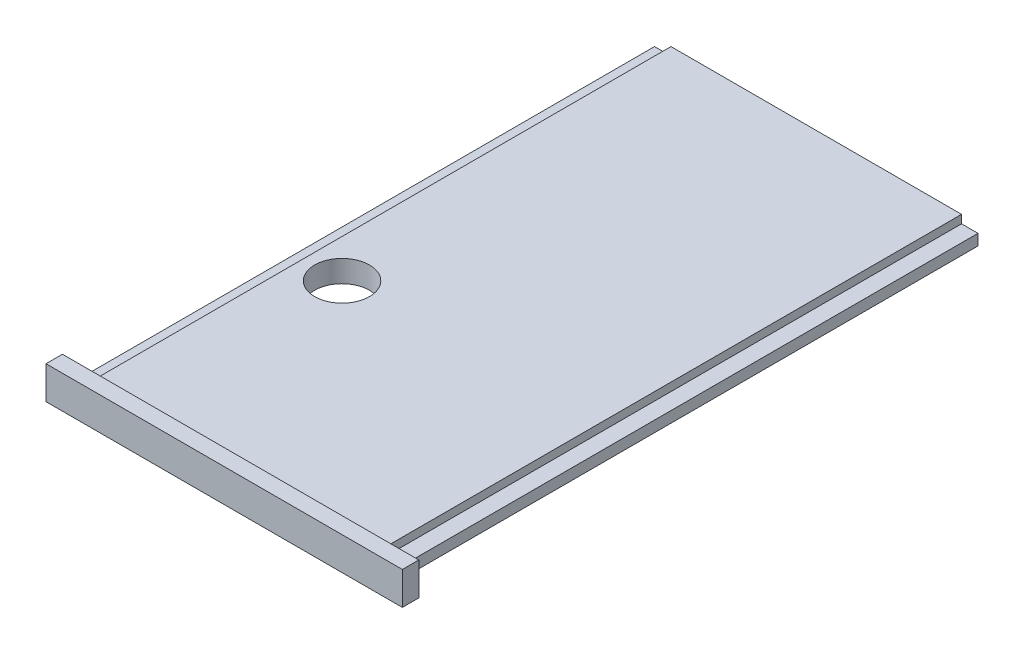
ISO-10303-21;
HEADER;
FILE_DESCRIPTION(('STEP AP214'),'2;1');
FILE_NAME('part.step','',(''),(''),'','','');
FILE_SCHEMA(('AUTOMOTIVE_DESIGN { 1 0 10303 214 1 1 1 1 }'));
ENDSEC;
DATA;
#1=APPLICATION_CONTEXT('core data for automotive mechanical design processes');
#2=APPLICATION_PROTOCOL_DEFINITION('international standard','automotive_design',2000,#1);
#3=PRODUCT_CONTEXT('',#1,'mechanical');
#4=PRODUCT('Part','Part','',(#3));
#5=PRODUCT_RELATED_PRODUCT_CATEGORY('part','',(#4));
#6=PRODUCT_DEFINITION_FORMATION('','',#4);
#7=PRODUCT_DEFINITION_CONTEXT('part definition',#1,'design');
#8=PRODUCT_DEFINITION('design','',#6,#7);
#9=PRODUCT_DEFINITION_SHAPE('','',#8);
#10=(LENGTH_UNIT() NAMED_UNIT(*) SI_UNIT(.MILLI.,.METRE.));
#11=(NAMED_UNIT(*) PLANE_ANGLE_UNIT() SI_UNIT($,.RADIAN.));
#12=(NAMED_UNIT(*) SI_UNIT($,.STERADIAN.) SOLID_ANGLE_UNIT());
#13=UNCERTAINTY_MEASURE_WITH_UNIT(LENGTH_MEASURE(1.E-05),#10,'distance_accuracy_value','');
#14=(GEOMETRIC_REPRESENTATION_CONTEXT(3) GLOBAL_UNCERTAINTY_ASSIGNED_CONTEXT((#13)) GLOBAL_UNIT_ASSIGNED_CONTEXT((#10,
#11,#12)) REPRESENTATION_CONTEXT('',''));
#15=CARTESIAN_POINT('',(0.,0.,0.));
#16=DIRECTION('',(0.,0.,1.));
#17=DIRECTION('',(1.,0.,0.));
#18=AXIS2_PLACEMENT_3D('',#15,#16,#17);
#19=CARTESIAN_POINT('',(0.,0.,0.));
#20=DIRECTION('',(0.,0.,-1.));
#21=DIRECTION('',(-1.,0.,0.));
#22=AXIS2_PLACEMENT_3D('',#19,#20,#21);
#23=PLANE('',#22);
#24=DIRECTION('',(0.,-1.,0.));
#25=VECTOR('',#24,1.);
#26=CARTESIAN_POINT('',(0.,0.,0.));
#27=LINE('',#26,#25);
#28=CARTESIAN_POINT('',(0.,6.,0.));
#29=VERTEX_POINT('',#28);
#30=CARTESIAN_POINT('',(0.,0.,0.));
#31=VERTEX_POINT('',#30);
#32=EDGE_CURVE('E296',#29,#31,#27,.T.);
#33=ORIENTED_EDGE('',*,*,#32,.F.);
#34=DIRECTION('',(-1.,0.,0.));
#35=VECTOR('',#34,1.);
#36=CARTESIAN_POINT('',(0.,6.,0.));
#37=LINE('',#36,#35);
#38=CARTESIAN_POINT('',(65.,6.,0.));
#39=VERTEX_POINT('',#38);
#40=EDGE_CURVE('E347',#39,#29,#37,.T.);
#41=ORIENTED_EDGE('',*,*,#40,.F.);
#42=DIRECTION('',(0.,1.,0.));
#43=VECTOR('',#42,1.);
#44=CARTESIAN_POINT('',(65.,0.,0.));
#45=LINE('',#44,#43);
#46=CARTESIAN_POINT('',(65.,0.,0.));
#47=VERTEX_POINT('',#46);
#48=EDGE_CURVE('E363',#47,#39,#45,.T.);
#49=ORIENTED_EDGE('',*,*,#48,.F.);
#50=DIRECTION('',(1.,0.,0.));
#51=VECTOR('',#50,1.);
#52=CARTESIAN_POINT('',(0.,0.,0.));
#53=LINE('',#52,#51);
#54=EDGE_CURVE('E360',#31,#47,#53,.T.);
#55=ORIENTED_EDGE('',*,*,#54,.F.);
#56=EDGE_LOOP('',(#33,#41,#49,#55));
#57=FACE_BOUND('',#56,.T.);
#58=DIRECTION('',(-1.,0.,0.));
#59=VECTOR('',#58,1.);
#60=CARTESIAN_POINT('',(59.,1.1,0.));
#61=LINE('',#60,#59);
#62=CARTESIAN_POINT('',(59.,1.1,0.));
#63=VERTEX_POINT('',#62);
#64=CARTESIAN_POINT('',(6.00000000000001,1.1,0.));
#65=VERTEX_POINT('',#64);
#66=EDGE_CURVE('E217',#63,#65,#61,.T.);
#67=ORIENTED_EDGE('',*,*,#66,.F.);
#68=DIRECTION('',(0.,1.,0.));
#69=VECTOR('',#68,1.);
#70=CARTESIAN_POINT('',(59.,1.1,0.));
#71=LINE('',#70,#69);
#72=CARTESIAN_POINT('',(59.,1.6,0.));
#73=VERTEX_POINT('',#72);
#74=EDGE_CURVE('E107',#63,#73,#71,.T.);
#75=ORIENTED_EDGE('',*,*,#74,.T.);
#76=DIRECTION('',(1.,0.,0.));
#77=VECTOR('',#76,1.);
#78=CARTESIAN_POINT('',(59.,1.6,0.));
#79=LINE('',#78,#77);
#80=CARTESIAN_POINT('',(62.,1.6,0.));
#81=VERTEX_POINT('',#80);
#82=EDGE_CURVE('E112',#73,#81,#79,.T.);
#83=ORIENTED_EDGE('',*,*,#82,.T.);
#84=DIRECTION('',(0.,-1.,0.));
#85=VECTOR('',#84,1.);
#86=CARTESIAN_POINT('',(62.,3.6,0.));
#87=LINE('',#86,#85);
#88=CARTESIAN_POINT('',(62.,3.6,0.));
#89=VERTEX_POINT('',#88);
#90=EDGE_CURVE('E286',#89,#81,#87,.T.);
#91=ORIENTED_EDGE('',*,*,#90,.F.);
#92=DIRECTION('',(1.,0.,0.));
#93=VECTOR('',#92,1.);
#94=CARTESIAN_POINT('',(59.,3.6,0.));
#95=LINE('',#94,#93);
#96=CARTESIAN_POINT('',(59.,3.6,0.));
#97=VERTEX_POINT('',#96);
#98=EDGE_CURVE('E277',#97,#89,#95,.T.);
#99=ORIENTED_EDGE('',*,*,#98,.F.);
#100=CARTESIAN_POINT('',(59.,5.1,0.));
#101=VERTEX_POINT('',#100);
#102=EDGE_CURVE('E250',#97,#101,#71,.T.);
#103=ORIENTED_EDGE('',*,*,#102,.T.);
#104=DIRECTION('',(-1.,0.,0.));
#105=VECTOR('',#104,1.);
#106=CARTESIAN_POINT('',(59.,5.1,0.));
#107=LINE('',#106,#105);
#108=CARTESIAN_POINT('',(6.00000000000001,5.1,0.));
#109=VERTEX_POINT('',#108);
#110=EDGE_CURVE('E224',#101,#109,#107,.T.);
#111=ORIENTED_EDGE('',*,*,#110,.T.);
#112=DIRECTION('',(0.,1.,0.));
#113=VECTOR('',#112,1.);
#114=CARTESIAN_POINT('',(6.00000000000001,1.1,0.));
#115=LINE('',#114,#113);
#116=CARTESIAN_POINT('',(6.00000000000001,3.6,0.));
#117=VERTEX_POINT('',#116);
#118=EDGE_CURVE('E253',#117,#109,#115,.T.);
#119=ORIENTED_EDGE('',*,*,#118,.F.);
#120=DIRECTION('',(-1.,0.,0.));
#121=VECTOR('',#120,1.);
#122=CARTESIAN_POINT('',(6.00000000000001,3.6,0.));
#123=LINE('',#122,#121);
#124=CARTESIAN_POINT('',(3.,3.6,0.));
#125=VERTEX_POINT('',#124);
#126=EDGE_CURVE('E311',#117,#125,#123,.T.);
#127=ORIENTED_EDGE('',*,*,#126,.T.);
#128=DIRECTION('',(0.,-1.,0.));
#129=VECTOR('',#128,1.);
#130=CARTESIAN_POINT('',(3.,3.6,0.));
#131=LINE('',#130,#129);
#132=CARTESIAN_POINT('',(3.,1.6,0.));
#133=VERTEX_POINT('',#132);
#134=EDGE_CURVE('E324',#125,#133,#131,.T.);
#135=ORIENTED_EDGE('',*,*,#134,.T.);
#136=DIRECTION('',(-1.,0.,0.));
#137=VECTOR('',#136,1.);
#138=CARTESIAN_POINT('',(6.00000000000001,1.6,0.));
#139=LINE('',#138,#137);
#140=CARTESIAN_POINT('',(6.00000000000001,1.6,0.));
#141=VERTEX_POINT('',#140);
#142=EDGE_CURVE('E320',#141,#133,#139,.T.);
#143=ORIENTED_EDGE('',*,*,#142,.F.);
#144=EDGE_CURVE('E254',#65,#141,#115,.T.);
#145=ORIENTED_EDGE('',*,*,#144,.F.);
#146=EDGE_LOOP('',(#67,#75,#83,#91,#99,#103,#111,#119,#127,#135,#143,#145));
#147=FACE_BOUND('',#146,.T.);
#148=ADVANCED_FACE('F91',(#57,#147),#23,.T.);
#149=CARTESIAN_POINT('',(0.,0.,3.));
#150=DIRECTION('',(1.,0.,0.));
#151=DIRECTION('',(0.,0.,-1.));
#152=AXIS2_PLACEMENT_3D('',#149,#150,#151);
#153=PLANE('',#152);
#154=ORIENTED_EDGE('',*,*,#32,.T.);
#155=DIRECTION('',(0.,0.,-1.));
#156=VECTOR('',#155,1.);
#157=CARTESIAN_POINT('',(0.,0.,3.));
#158=LINE('',#157,#156);
#159=CARTESIAN_POINT('',(0.,0.,3.));
#160=VERTEX_POINT('',#159);
#161=EDGE_CURVE('E12',#160,#31,#158,.T.);
#162=ORIENTED_EDGE('',*,*,#161,.F.);
#163=DIRECTION('',(0.,-1.,0.));
#164=VECTOR('',#163,1.);
#165=CARTESIAN_POINT('',(0.,0.,3.));
#166=LINE('',#165,#164);
#167=CARTESIAN_POINT('',(0.,6.,3.));
#168=VERTEX_POINT('',#167);
#169=EDGE_CURVE('E342',#168,#160,#166,.T.);
#170=ORIENTED_EDGE('',*,*,#169,.F.);
#171=DIRECTION('',(0.,0.,-1.));
#172=VECTOR('',#171,1.);
#173=CARTESIAN_POINT('',(0.,6.,3.));
#174=LINE('',#173,#172);
#175=EDGE_CURVE('E356',#168,#29,#174,.T.);
#176=ORIENTED_EDGE('',*,*,#175,.T.);
#177=EDGE_LOOP('',(#154,#162,#170,#176));
#178=FACE_BOUND('',#177,.T.);
#179=ADVANCED_FACE('F93',(#178),#153,.F.);
#180=CARTESIAN_POINT('',(0.,0.,3.));
#181=DIRECTION('',(0.,1.,0.));
#182=DIRECTION('',(0.,0.,1.));
#183=AXIS2_PLACEMENT_3D('',#180,#181,#182);
#184=PLANE('',#183);
#185=ORIENTED_EDGE('',*,*,#54,.T.);
#186=DIRECTION('',(0.,0.,-1.));
#187=VECTOR('',#186,1.);
#188=CARTESIAN_POINT('',(65.,0.,3.));
#189=LINE('',#188,#187);
#190=CARTESIAN_POINT('',(65.,0.,3.));
#191=VERTEX_POINT('',#190);
#192=EDGE_CURVE('E100',#191,#47,#189,.T.);
#193=ORIENTED_EDGE('',*,*,#192,.F.);
#194=DIRECTION('',(1.,0.,0.));
#195=VECTOR('',#194,1.);
#196=CARTESIAN_POINT('',(0.,0.,3.));
#197=LINE('',#196,#195);
#198=EDGE_CURVE('E346',#160,#191,#197,.T.);
#199=ORIENTED_EDGE('',*,*,#198,.F.);
#200=ORIENTED_EDGE('',*,*,#161,.T.);
#201=EDGE_LOOP('',(#185,#193,#199,#200));
#202=FACE_BOUND('',#201,.T.);
#203=ADVANCED_FACE('F395',(#202),#184,.F.);
#204=CARTESIAN_POINT('',(65.,0.,3.));
#205=DIRECTION('',(-1.,0.,0.));
#206=DIRECTION('',(0.,0.,1.));
#207=AXIS2_PLACEMENT_3D('',#204,#205,#206);
#208=PLANE('',#207);
#209=ORIENTED_EDGE('',*,*,#48,.T.);
#210=DIRECTION('',(0.,0.,-1.));
#211=VECTOR('',#210,1.);
#212=CARTESIAN_POINT('',(65.,6.,3.));
#213=LINE('',#212,#211);
#214=CARTESIAN_POINT('',(65.,6.,3.));
#215=VERTEX_POINT('',#214);
#216=EDGE_CURVE('E371',#215,#39,#213,.T.);
#217=ORIENTED_EDGE('',*,*,#216,.F.);
#218=DIRECTION('',(0.,1.,0.));
#219=VECTOR('',#218,1.);
#220=CARTESIAN_POINT('',(65.,0.,3.));
#221=LINE('',#220,#219);
#222=EDGE_CURVE('E350',#191,#215,#221,.T.);
#223=ORIENTED_EDGE('',*,*,#222,.F.);
#224=ORIENTED_EDGE('',*,*,#192,.T.);
#225=EDGE_LOOP('',(#209,#217,#223,#224));
#226=FACE_BOUND('',#225,.T.);
#227=ADVANCED_FACE('F380',(#226),#208,.F.);
#228=CARTESIAN_POINT('',(0.,6.,3.));
#229=DIRECTION('',(0.,-1.,0.));
#230=DIRECTION('',(0.,0.,-1.));
#231=AXIS2_PLACEMENT_3D('',#228,#229,#230);
#232=PLANE('',#231);
#233=ORIENTED_EDGE('',*,*,#40,.T.);
#234=ORIENTED_EDGE('',*,*,#175,.F.);
#235=DIRECTION('',(-1.,0.,0.));
#236=VECTOR('',#235,1.);
#237=CARTESIAN_POINT('',(0.,6.,3.));
#238=LINE('',#237,#236);
#239=EDGE_CURVE('E353',#215,#168,#238,.T.);
#240=ORIENTED_EDGE('',*,*,#239,.F.);
#241=ORIENTED_EDGE('',*,*,#216,.T.);
#242=EDGE_LOOP('',(#233,#234,#240,#241));
#243=FACE_BOUND('',#242,.T.);
#244=ADVANCED_FACE('F388',(#243),#232,.F.);
#245=CARTESIAN_POINT('',(0.,0.,3.));
#246=DIRECTION('',(0.,0.,-1.));
#247=DIRECTION('',(-1.,0.,0.));
#248=AXIS2_PLACEMENT_3D('',#245,#246,#247);
#249=PLANE('',#248);
#250=ORIENTED_EDGE('',*,*,#169,.T.);
#251=ORIENTED_EDGE('',*,*,#198,.T.);
#252=ORIENTED_EDGE('',*,*,#222,.T.);
#253=ORIENTED_EDGE('',*,*,#239,.T.);
#254=EDGE_LOOP('',(#250,#251,#252,#253));
#255=FACE_BOUND('',#254,.T.);
#256=ADVANCED_FACE('F394',(#255),#249,.F.);
#257=CARTESIAN_POINT('',(59.,1.1,-105.));
#258=DIRECTION('',(0.,1.,0.));
#259=DIRECTION('',(0.,0.,1.));
#260=AXIS2_PLACEMENT_3D('',#257,#258,#259);
#261=PLANE('',#260);
#262=CARTESIAN_POINT('',(13.,1.1,-38.));
#263=DIRECTION('',(0.,1.,0.));
#264=DIRECTION('',(0.,0.,1.));
#265=AXIS2_PLACEMENT_3D('',#262,#263,#264);
#266=CIRCLE('',#265,5.);
#267=CARTESIAN_POINT('',(13.,1.1,-33.));
#268=VERTEX_POINT('',#267);
#269=EDGE_CURVE('E325',#268,#268,#266,.T.);
#270=ORIENTED_EDGE('',*,*,#269,.T.);
#271=EDGE_LOOP('',(#270));
#272=FACE_BOUND('',#271,.T.);
#273=ORIENTED_EDGE('',*,*,#66,.T.);
#274=DIRECTION('',(0.,0.,1.));
#275=VECTOR('',#274,1.);
#276=CARTESIAN_POINT('',(6.00000000000001,1.1,-105.));
#277=LINE('',#276,#275);
#278=CARTESIAN_POINT('',(6.00000000000001,1.1,-105.));
#279=VERTEX_POINT('',#278);
#280=EDGE_CURVE('E266',#279,#65,#277,.T.);
#281=ORIENTED_EDGE('',*,*,#280,.F.);
#282=DIRECTION('',(-1.,0.,0.));
#283=VECTOR('',#282,1.);
#284=CARTESIAN_POINT('',(59.,1.1,-105.));
#285=LINE('',#284,#283);
#286=CARTESIAN_POINT('',(59.,1.1,-105.));
#287=VERTEX_POINT('',#286);
#288=EDGE_CURVE('E227',#287,#279,#285,.T.);
#289=ORIENTED_EDGE('',*,*,#288,.F.);
#290=DIRECTION('',(0.,0.,1.));
#291=VECTOR('',#290,1.);
#292=CARTESIAN_POINT('',(59.,1.1,-105.));
#293=LINE('',#292,#291);
#294=EDGE_CURVE('E261',#287,#63,#293,.T.);
#295=ORIENTED_EDGE('',*,*,#294,.T.);
#296=EDGE_LOOP('',(#273,#281,#289,#295));
#297=FACE_BOUND('',#296,.T.);
#298=ADVANCED_FACE('F413',(#272,#297),#261,.F.);
#299=CARTESIAN_POINT('',(59.,5.1,-105.));
#300=DIRECTION('',(0.,1.,0.));
#301=DIRECTION('',(0.,0.,1.));
#302=AXIS2_PLACEMENT_3D('',#299,#300,#301);
#303=PLANE('',#302);
#304=CARTESIAN_POINT('',(13.,5.1,-38.));
#305=DIRECTION('',(0.,1.,0.));
#306=DIRECTION('',(0.,0.,1.));
#307=AXIS2_PLACEMENT_3D('',#304,#305,#306);
#308=CIRCLE('',#307,5.);
#309=CARTESIAN_POINT('',(13.,5.1,-33.));
#310=VERTEX_POINT('',#309);
#311=EDGE_CURVE('E472',#310,#310,#308,.T.);
#312=ORIENTED_EDGE('',*,*,#311,.F.);
#313=EDGE_LOOP('',(#312));
#314=FACE_BOUND('',#313,.T.);
#315=ORIENTED_EDGE('',*,*,#110,.F.);
#316=DIRECTION('',(0.,0.,1.));
#317=VECTOR('',#316,1.);
#318=CARTESIAN_POINT('',(59.,5.1,-105.));
#319=LINE('',#318,#317);
#320=CARTESIAN_POINT('',(59.,5.1,-105.));
#321=VERTEX_POINT('',#320);
#322=EDGE_CURVE('E208',#321,#101,#319,.T.);
#323=ORIENTED_EDGE('',*,*,#322,.F.);
#324=DIRECTION('',(-1.,0.,0.));
#325=VECTOR('',#324,1.);
#326=CARTESIAN_POINT('',(59.,5.1,-105.));
#327=LINE('',#326,#325);
#328=CARTESIAN_POINT('',(6.00000000000001,5.1,-105.));
#329=VERTEX_POINT('',#328);
#330=EDGE_CURVE('E223',#321,#329,#327,.T.);
#331=ORIENTED_EDGE('',*,*,#330,.T.);
#332=DIRECTION('',(0.,0.,1.));
#333=VECTOR('',#332,1.);
#334=CARTESIAN_POINT('',(6.00000000000001,5.1,-105.));
#335=LINE('',#334,#333);
#336=EDGE_CURVE('E226',#329,#109,#335,.T.);
#337=ORIENTED_EDGE('',*,*,#336,.T.);
#338=EDGE_LOOP('',(#315,#323,#331,#337));
#339=FACE_BOUND('',#338,.T.);
#340=ADVANCED_FACE('F221',(#314,#339),#303,.T.);
#341=CARTESIAN_POINT('',(0.,0.,-105.));
#342=DIRECTION('',(0.,0.,1.));
#343=DIRECTION('',(1.,0.,0.));
#344=AXIS2_PLACEMENT_3D('',#341,#342,#343);
#345=PLANE('',#344);
#346=DIRECTION('',(0.,1.,0.));
#347=VECTOR('',#346,1.);
#348=CARTESIAN_POINT('',(59.,1.1,-105.));
#349=LINE('',#348,#347);
#350=CARTESIAN_POINT('',(59.,1.6,-105.));
#351=VERTEX_POINT('',#350);
#352=EDGE_CURVE('E216',#287,#351,#349,.T.);
#353=ORIENTED_EDGE('',*,*,#352,.F.);
#354=ORIENTED_EDGE('',*,*,#288,.T.);
#355=DIRECTION('',(0.,1.,0.));
#356=VECTOR('',#355,1.);
#357=CARTESIAN_POINT('',(6.00000000000001,1.1,-105.));
#358=LINE('',#357,#356);
#359=CARTESIAN_POINT('',(6.00000000000001,1.6,-105.));
#360=VERTEX_POINT('',#359);
#361=EDGE_CURVE('E239',#279,#360,#358,.T.);
#362=ORIENTED_EDGE('',*,*,#361,.T.);
#363=DIRECTION('',(-1.,0.,0.));
#364=VECTOR('',#363,1.);
#365=CARTESIAN_POINT('',(6.00000000000001,1.6,-105.));
#366=LINE('',#365,#364);
#367=CARTESIAN_POINT('',(3.,1.6,-105.));
#368=VERTEX_POINT('',#367);
#369=EDGE_CURVE('E307',#360,#368,#366,.T.);
#370=ORIENTED_EDGE('',*,*,#369,.T.);
#371=DIRECTION('',(0.,-1.,0.));
#372=VECTOR('',#371,1.);
#373=CARTESIAN_POINT('',(3.,3.6,-105.));
#374=LINE('',#373,#372);
#375=CARTESIAN_POINT('',(3.,3.6,-105.));
#376=VERTEX_POINT('',#375);
#377=EDGE_CURVE('E310',#376,#368,#374,.T.);
#378=ORIENTED_EDGE('',*,*,#377,.F.);
#379=DIRECTION('',(-1.,0.,0.));
#380=VECTOR('',#379,1.);
#381=CARTESIAN_POINT('',(6.00000000000001,3.6,-105.));
#382=LINE('',#381,#380);
#383=CARTESIAN_POINT('',(6.00000000000001,3.6,-105.));
#384=VERTEX_POINT('',#383);
#385=EDGE_CURVE('E315',#384,#376,#382,.T.);
#386=ORIENTED_EDGE('',*,*,#385,.F.);
#387=EDGE_CURVE('E233',#384,#329,#358,.T.);
#388=ORIENTED_EDGE('',*,*,#387,.T.);
#389=ORIENTED_EDGE('',*,*,#330,.F.);
#390=CARTESIAN_POINT('',(59.,3.6,-105.));
#391=VERTEX_POINT('',#390);
#392=EDGE_CURVE('E204',#391,#321,#349,.T.);
#393=ORIENTED_EDGE('',*,*,#392,.F.);
#394=DIRECTION('',(1.,0.,0.));
#395=VECTOR('',#394,1.);
#396=CARTESIAN_POINT('',(59.,3.6,-105.));
#397=LINE('',#396,#395);
#398=CARTESIAN_POINT('',(62.,3.6,-105.));
#399=VERTEX_POINT('',#398);
#400=EDGE_CURVE('E280',#391,#399,#397,.T.);
#401=ORIENTED_EDGE('',*,*,#400,.T.);
#402=DIRECTION('',(0.,-1.,0.));
#403=VECTOR('',#402,1.);
#404=CARTESIAN_POINT('',(62.,3.6,-105.));
#405=LINE('',#404,#403);
#406=CARTESIAN_POINT('',(62.,1.6,-105.));
#407=VERTEX_POINT('',#406);
#408=EDGE_CURVE('E276',#399,#407,#405,.T.);
#409=ORIENTED_EDGE('',*,*,#408,.T.);
#410=DIRECTION('',(1.,0.,0.));
#411=VECTOR('',#410,1.);
#412=CARTESIAN_POINT('',(59.,1.6,-105.));
#413=LINE('',#412,#411);
#414=EDGE_CURVE('E272',#351,#407,#413,.T.);
#415=ORIENTED_EDGE('',*,*,#414,.F.);
#416=EDGE_LOOP('',(#353,#354,#362,#370,#378,#386,#388,#389,#393,#401,#409,#415));
#417=FACE_BOUND('',#416,.T.);
#418=ADVANCED_FACE('F230',(#417),#345,.F.);
#419=CARTESIAN_POINT('',(6.00000000000001,1.1,-105.));
#420=DIRECTION('',(1.,0.,0.));
#421=DIRECTION('',(0.,0.,-1.));
#422=AXIS2_PLACEMENT_3D('',#419,#420,#421);
#423=PLANE('',#422);
#424=ORIENTED_EDGE('',*,*,#387,.F.);
#425=DIRECTION('',(0.,0.,1.));
#426=VECTOR('',#425,1.);
#427=CARTESIAN_POINT('',(6.00000000000001,3.6,-105.));
#428=LINE('',#427,#426);
#429=EDGE_CURVE('E265',#384,#117,#428,.T.);
#430=ORIENTED_EDGE('',*,*,#429,.T.);
#431=ORIENTED_EDGE('',*,*,#118,.T.);
#432=ORIENTED_EDGE('',*,*,#336,.F.);
#433=EDGE_LOOP('',(#424,#430,#431,#432));
#434=FACE_BOUND('',#433,.T.);
#435=ADVANCED_FACE('F429',(#434),#423,.F.);
#436=DIRECTION('',(0.,0.,1.));
#437=VECTOR('',#436,1.);
#438=CARTESIAN_POINT('',(6.00000000000001,1.6,-105.));
#439=LINE('',#438,#437);
#440=EDGE_CURVE('E306',#360,#141,#439,.T.);
#441=ORIENTED_EDGE('',*,*,#440,.F.);
#442=ORIENTED_EDGE('',*,*,#361,.F.);
#443=ORIENTED_EDGE('',*,*,#280,.T.);
#444=ORIENTED_EDGE('',*,*,#144,.T.);
#445=EDGE_LOOP('',(#441,#442,#443,#444));
#446=FACE_BOUND('',#445,.T.);
#447=ADVANCED_FACE('F431',(#446),#423,.F.);
#448=CARTESIAN_POINT('',(59.,1.1,-105.));
#449=DIRECTION('',(1.,0.,0.));
#450=DIRECTION('',(0.,0.,-1.));
#451=AXIS2_PLACEMENT_3D('',#448,#449,#450);
#452=PLANE('',#451);
#453=ORIENTED_EDGE('',*,*,#352,.T.);
#454=DIRECTION('',(0.,0.,1.));
#455=VECTOR('',#454,1.);
#456=CARTESIAN_POINT('',(59.,1.6,-105.));
#457=LINE('',#456,#455);
#458=EDGE_CURVE('E297',#351,#73,#457,.T.);
#459=ORIENTED_EDGE('',*,*,#458,.T.);
#460=ORIENTED_EDGE('',*,*,#74,.F.);
#461=ORIENTED_EDGE('',*,*,#294,.F.);
#462=EDGE_LOOP('',(#453,#459,#460,#461));
#463=FACE_BOUND('',#462,.T.);
#464=ADVANCED_FACE('F437',(#463),#452,.T.);
#465=DIRECTION('',(0.,0.,1.));
#466=VECTOR('',#465,1.);
#467=CARTESIAN_POINT('',(59.,3.6,-105.));
#468=LINE('',#467,#466);
#469=EDGE_CURVE('E211',#391,#97,#468,.T.);
#470=ORIENTED_EDGE('',*,*,#469,.F.);
#471=ORIENTED_EDGE('',*,*,#392,.T.);
#472=ORIENTED_EDGE('',*,*,#322,.T.);
#473=ORIENTED_EDGE('',*,*,#102,.F.);
#474=EDGE_LOOP('',(#470,#471,#472,#473));
#475=FACE_BOUND('',#474,.T.);
#476=ADVANCED_FACE('F206',(#475),#452,.T.);
#477=CARTESIAN_POINT('',(3.,3.6,-105.));
#478=DIRECTION('',(-1.,0.,0.));
#479=DIRECTION('',(0.,0.,1.));
#480=AXIS2_PLACEMENT_3D('',#477,#478,#479);
#481=PLANE('',#480);
#482=ORIENTED_EDGE('',*,*,#134,.F.);
#483=DIRECTION('',(0.,0.,1.));
#484=VECTOR('',#483,1.);
#485=CARTESIAN_POINT('',(3.,3.6,-105.));
#486=LINE('',#485,#484);
#487=EDGE_CURVE('E319',#376,#125,#486,.T.);
#488=ORIENTED_EDGE('',*,*,#487,.F.);
#489=ORIENTED_EDGE('',*,*,#377,.T.);
#490=DIRECTION('',(0.,0.,1.));
#491=VECTOR('',#490,1.);
#492=CARTESIAN_POINT('',(3.,1.6,-105.));
#493=LINE('',#492,#491);
#494=EDGE_CURVE('E287',#368,#133,#493,.T.);
#495=ORIENTED_EDGE('',*,*,#494,.T.);
#496=EDGE_LOOP('',(#482,#488,#489,#495));
#497=FACE_BOUND('',#496,.T.);
#498=ADVANCED_FACE('F436',(#497),#481,.T.);
#499=CARTESIAN_POINT('',(6.00000000000001,3.6,-105.));
#500=DIRECTION('',(0.,1.,0.));
#501=DIRECTION('',(0.,0.,1.));
#502=AXIS2_PLACEMENT_3D('',#499,#500,#501);
#503=PLANE('',#502);
#504=ORIENTED_EDGE('',*,*,#126,.F.);
#505=ORIENTED_EDGE('',*,*,#429,.F.);
#506=ORIENTED_EDGE('',*,*,#385,.T.);
#507=ORIENTED_EDGE('',*,*,#487,.T.);
#508=EDGE_LOOP('',(#504,#505,#506,#507));
#509=FACE_BOUND('',#508,.T.);
#510=ADVANCED_FACE('F446',(#509),#503,.T.);
#511=CARTESIAN_POINT('',(6.00000000000001,1.6,-105.));
#512=DIRECTION('',(0.,1.,0.));
#513=DIRECTION('',(-1.,0.,0.));
#514=AXIS2_PLACEMENT_3D('',#511,#512,#513);
#515=PLANE('',#514);
#516=ORIENTED_EDGE('',*,*,#142,.T.);
#517=ORIENTED_EDGE('',*,*,#494,.F.);
#518=ORIENTED_EDGE('',*,*,#369,.F.);
#519=ORIENTED_EDGE('',*,*,#440,.T.);
#520=EDGE_LOOP('',(#516,#517,#518,#519));
#521=FACE_BOUND('',#520,.T.);
#522=ADVANCED_FACE('F438',(#521),#515,.F.);
#523=CARTESIAN_POINT('',(62.,3.6,-105.));
#524=DIRECTION('',(-1.,0.,0.));
#525=DIRECTION('',(0.,0.,1.));
#526=AXIS2_PLACEMENT_3D('',#523,#524,#525);
#527=PLANE('',#526);
#528=ORIENTED_EDGE('',*,*,#90,.T.);
#529=DIRECTION('',(0.,0.,1.));
#530=VECTOR('',#529,1.);
#531=CARTESIAN_POINT('',(62.,1.6,-105.));
#532=LINE('',#531,#530);
#533=EDGE_CURVE('E283',#407,#81,#532,.T.);
#534=ORIENTED_EDGE('',*,*,#533,.F.);
#535=ORIENTED_EDGE('',*,*,#408,.F.);
#536=DIRECTION('',(0.,0.,1.));
#537=VECTOR('',#536,1.);
#538=CARTESIAN_POINT('',(62.,3.6,-105.));
#539=LINE('',#538,#537);
#540=EDGE_CURVE('E298',#399,#89,#539,.T.);
#541=ORIENTED_EDGE('',*,*,#540,.T.);
#542=EDGE_LOOP('',(#528,#534,#535,#541));
#543=FACE_BOUND('',#542,.T.);
#544=ADVANCED_FACE('F445',(#543),#527,.F.);
#545=CARTESIAN_POINT('',(59.,1.6,-105.));
#546=DIRECTION('',(0.,-1.,0.));
#547=DIRECTION('',(1.,0.,0.));
#548=AXIS2_PLACEMENT_3D('',#545,#546,#547);
#549=PLANE('',#548);
#550=ORIENTED_EDGE('',*,*,#82,.F.);
#551=ORIENTED_EDGE('',*,*,#458,.F.);
#552=ORIENTED_EDGE('',*,*,#414,.T.);
#553=ORIENTED_EDGE('',*,*,#533,.T.);
#554=EDGE_LOOP('',(#550,#551,#552,#553));
#555=FACE_BOUND('',#554,.T.);
#556=ADVANCED_FACE('F443',(#555),#549,.T.);
#557=CARTESIAN_POINT('',(59.,3.6,-105.));
#558=DIRECTION('',(0.,-1.,0.));
#559=DIRECTION('',(0.,0.,-1.));
#560=AXIS2_PLACEMENT_3D('',#557,#558,#559);
#561=PLANE('',#560);
#562=ORIENTED_EDGE('',*,*,#98,.T.);
#563=ORIENTED_EDGE('',*,*,#540,.F.);
#564=ORIENTED_EDGE('',*,*,#400,.F.);
#565=ORIENTED_EDGE('',*,*,#469,.T.);
#566=EDGE_LOOP('',(#562,#563,#564,#565));
#567=FACE_BOUND('',#566,.T.);
#568=ADVANCED_FACE('F439',(#567),#561,.F.);
#569=CARTESIAN_POINT('',(13.,-92.9,-38.));
#570=DIRECTION('',(0.,1.,0.));
#571=DIRECTION('',(0.,0.,1.));
#572=AXIS2_PLACEMENT_3D('',#569,#570,#571);
#573=CYLINDRICAL_SURFACE('',#572,5.);
#574=ORIENTED_EDGE('',*,*,#311,.T.);
#575=EDGE_LOOP('',(#574));
#576=FACE_BOUND('',#575,.T.);
#577=ORIENTED_EDGE('',*,*,#269,.F.);
#578=EDGE_LOOP('',(#577));
#579=FACE_BOUND('',#578,.T.);
#580=ADVANCED_FACE('F442',(#576,#579),#573,.F.);
#581=CLOSED_SHELL('',(#148,#179,#203,#227,#244,#256,#298,#340,#418,#435,#447,#464,#476,#498,
#510,#522,#544,#556,#568,#580));
#582=MANIFOLD_SOLID_BREP('B2',#581);
#583=ADVANCED_BREP_SHAPE_REPRESENTATION('',(#18,#582),#14);
#584=SHAPE_DEFINITION_REPRESENTATION(#9,#583);
ENDSEC;
END-ISO-10303-21;
